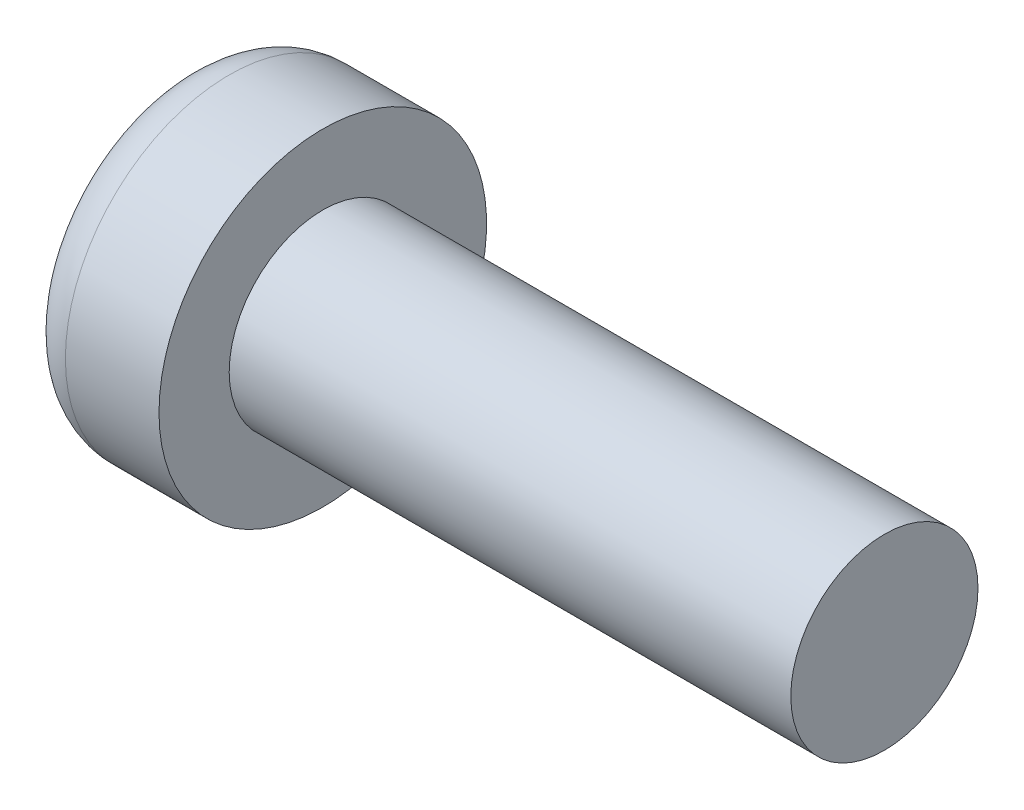
ISO-10303-21;
HEADER;
FILE_DESCRIPTION(('STEP AP214'),'2;1');
FILE_NAME('part.step','',(''),(''),'','','');
FILE_SCHEMA(('AUTOMOTIVE_DESIGN { 1 0 10303 214 1 1 1 1 }'));
ENDSEC;
DATA;
#1=APPLICATION_CONTEXT('core data for automotive mechanical design processes');
#2=APPLICATION_PROTOCOL_DEFINITION('international standard','automotive_design',2000,#1);
#3=PRODUCT_CONTEXT('',#1,'mechanical');
#4=PRODUCT('Part','Part','',(#3));
#5=PRODUCT_RELATED_PRODUCT_CATEGORY('part','',(#4));
#6=PRODUCT_DEFINITION_FORMATION('','',#4);
#7=PRODUCT_DEFINITION_CONTEXT('part definition',#1,'design');
#8=PRODUCT_DEFINITION('design','',#6,#7);
#9=PRODUCT_DEFINITION_SHAPE('','',#8);
#10=(LENGTH_UNIT() NAMED_UNIT(*) SI_UNIT(.MILLI.,.METRE.));
#11=(NAMED_UNIT(*) PLANE_ANGLE_UNIT() SI_UNIT($,.RADIAN.));
#12=(NAMED_UNIT(*) SI_UNIT($,.STERADIAN.) SOLID_ANGLE_UNIT());
#13=UNCERTAINTY_MEASURE_WITH_UNIT(LENGTH_MEASURE(1.E-05),#10,'distance_accuracy_value','');
#14=(GEOMETRIC_REPRESENTATION_CONTEXT(3) GLOBAL_UNCERTAINTY_ASSIGNED_CONTEXT((#13)) GLOBAL_UNIT_ASSIGNED_CONTEXT((#10,
#11,#12)) REPRESENTATION_CONTEXT('',''));
#15=CARTESIAN_POINT('',(0.,0.,0.));
#16=DIRECTION('',(0.,0.,1.));
#17=DIRECTION('',(1.,0.,0.));
#18=AXIS2_PLACEMENT_3D('',#15,#16,#17);
#19=CARTESIAN_POINT('',(0.,0.,0.));
#20=DIRECTION('',(1.,0.,0.));
#21=DIRECTION('',(0.,0.,-1.));
#22=AXIS2_PLACEMENT_3D('',#19,#20,#21);
#23=PLANE('',#22);
#24=CARTESIAN_POINT('',(0.,0.,0.));
#25=DIRECTION('',(-1.,0.,0.));
#26=DIRECTION('',(0.,0.,1.));
#27=AXIS2_PLACEMENT_3D('',#24,#25,#26);
#28=CIRCLE('',#27,1.25);
#29=CARTESIAN_POINT('',(0.,0.,1.25));
#30=VERTEX_POINT('',#29);
#31=EDGE_CURVE('E10',#30,#30,#28,.T.);
#32=ORIENTED_EDGE('',*,*,#31,.T.);
#33=EDGE_LOOP('',(#32));
#34=FACE_BOUND('',#33,.T.);
#35=ADVANCED_FACE('F35',(#34),#23,.F.);
#36=CARTESIAN_POINT('',(0.5,0.,0.));
#37=DIRECTION('',(-1.,0.,0.));
#38=DIRECTION('',(0.,0.,1.));
#39=AXIS2_PLACEMENT_3D('',#36,#37,#38);
#40=TOROIDAL_SURFACE('',#39,1.25,0.5);
#41=ORIENTED_EDGE('',*,*,#31,.F.);
#42=EDGE_LOOP('',(#41));
#43=FACE_BOUND('',#42,.T.);
#44=CARTESIAN_POINT('',(0.500000000000004,0.,0.));
#45=DIRECTION('',(-1.,0.,0.));
#46=DIRECTION('',(0.,0.,1.));
#47=AXIS2_PLACEMENT_3D('',#44,#45,#46);
#48=CIRCLE('',#47,1.75);
#49=CARTESIAN_POINT('',(0.500000000000004,0.,1.75));
#50=VERTEX_POINT('',#49);
#51=EDGE_CURVE('E41',#50,#50,#48,.T.);
#52=ORIENTED_EDGE('',*,*,#51,.T.);
#53=EDGE_LOOP('',(#52));
#54=FACE_BOUND('',#53,.T.);
#55=ADVANCED_FACE('F70',(#43,#54),#40,.T.);
#56=CARTESIAN_POINT('',(0.,0.,0.));
#57=DIRECTION('',(-1.,0.,0.));
#58=DIRECTION('',(0.,0.,1.));
#59=AXIS2_PLACEMENT_3D('',#56,#57,#58);
#60=CYLINDRICAL_SURFACE('',#59,1.75);
#61=ORIENTED_EDGE('',*,*,#51,.F.);
#62=EDGE_LOOP('',(#61));
#63=FACE_BOUND('',#62,.T.);
#64=CARTESIAN_POINT('',(1.5,0.,0.));
#65=DIRECTION('',(-1.,0.,0.));
#66=DIRECTION('',(0.,0.,1.));
#67=AXIS2_PLACEMENT_3D('',#64,#65,#66);
#68=CIRCLE('',#67,1.75);
#69=CARTESIAN_POINT('',(1.5,0.,1.75));
#70=VERTEX_POINT('',#69);
#71=EDGE_CURVE('E45',#70,#70,#68,.T.);
#72=ORIENTED_EDGE('',*,*,#71,.T.);
#73=EDGE_LOOP('',(#72));
#74=FACE_BOUND('',#73,.T.);
#75=ADVANCED_FACE('F74',(#63,#74),#60,.T.);
#76=CARTESIAN_POINT('',(1.5,1.,0.));
#77=DIRECTION('',(-1.,0.,0.));
#78=DIRECTION('',(0.,0.,1.));
#79=AXIS2_PLACEMENT_3D('',#76,#77,#78);
#80=PLANE('',#79);
#81=ORIENTED_EDGE('',*,*,#71,.F.);
#82=EDGE_LOOP('',(#81));
#83=FACE_BOUND('',#82,.T.);
#84=CARTESIAN_POINT('',(1.5,0.,0.));
#85=DIRECTION('',(-1.,0.,0.));
#86=DIRECTION('',(0.,0.,1.));
#87=AXIS2_PLACEMENT_3D('',#84,#85,#86);
#88=CIRCLE('',#87,1.);
#89=CARTESIAN_POINT('',(1.5,0.,1.));
#90=VERTEX_POINT('',#89);
#91=EDGE_CURVE('E49',#90,#90,#88,.T.);
#92=ORIENTED_EDGE('',*,*,#91,.T.);
#93=EDGE_LOOP('',(#92));
#94=FACE_BOUND('',#93,.T.);
#95=ADVANCED_FACE('F66',(#83,#94),#80,.F.);
#96=CARTESIAN_POINT('',(0.,0.,0.));
#97=DIRECTION('',(-1.,0.,0.));
#98=DIRECTION('',(0.,0.,1.));
#99=AXIS2_PLACEMENT_3D('',#96,#97,#98);
#100=CYLINDRICAL_SURFACE('',#99,1.);
#101=ORIENTED_EDGE('',*,*,#91,.F.);
#102=EDGE_LOOP('',(#101));
#103=FACE_BOUND('',#102,.T.);
#104=CARTESIAN_POINT('',(7.5,0.,0.));
#105=DIRECTION('',(-1.,0.,0.));
#106=DIRECTION('',(0.,0.,1.));
#107=AXIS2_PLACEMENT_3D('',#104,#105,#106);
#108=CIRCLE('',#107,1.);
#109=CARTESIAN_POINT('',(7.5,0.,1.));
#110=VERTEX_POINT('',#109);
#111=EDGE_CURVE('E54',#110,#110,#108,.T.);
#112=ORIENTED_EDGE('',*,*,#111,.T.);
#113=EDGE_LOOP('',(#112));
#114=FACE_BOUND('',#113,.T.);
#115=ADVANCED_FACE('F58',(#103,#114),#100,.T.);
#116=CARTESIAN_POINT('',(7.5,1.,0.));
#117=DIRECTION('',(-1.,0.,0.));
#118=DIRECTION('',(0.,0.,1.));
#119=AXIS2_PLACEMENT_3D('',#116,#117,#118);
#120=PLANE('',#119);
#121=ORIENTED_EDGE('',*,*,#111,.F.);
#122=EDGE_LOOP('',(#121));
#123=FACE_BOUND('',#122,.T.);
#124=ADVANCED_FACE('F60',(#123),#120,.F.);
#125=CLOSED_SHELL('',(#35,#55,#75,#95,#115,#124));
#126=MANIFOLD_SOLID_BREP('B2',#125);
#127=ADVANCED_BREP_SHAPE_REPRESENTATION('',(#18,#126),#14);
#128=SHAPE_DEFINITION_REPRESENTATION(#9,#127);
ENDSEC;
END-ISO-10303-21;
